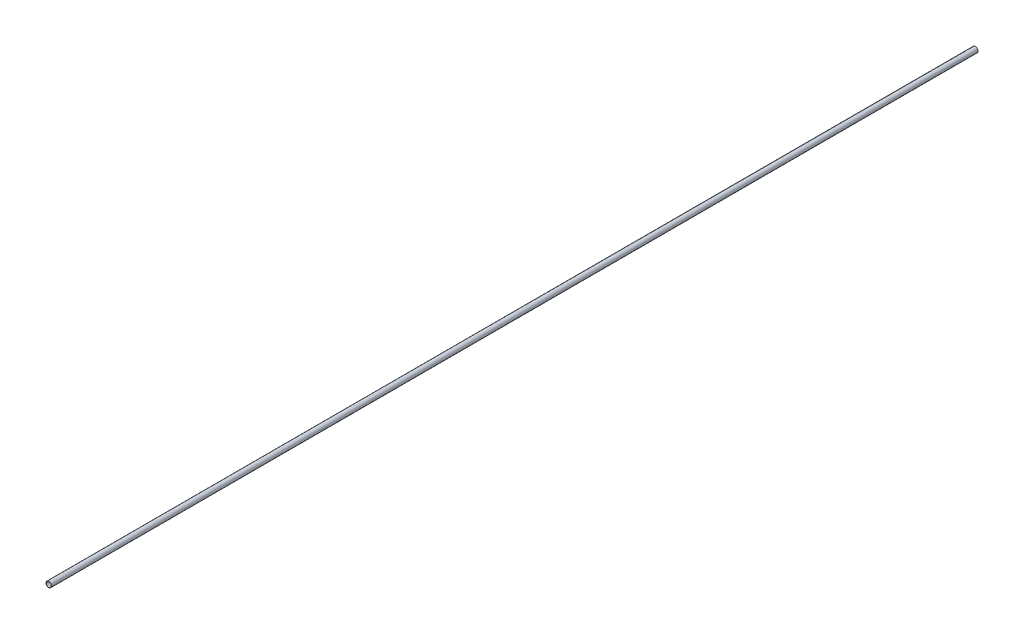
ISO-10303-21;
HEADER;
FILE_DESCRIPTION(('STEP AP214'),'2;1');
FILE_NAME('part.step','',(''),(''),'','','');
FILE_SCHEMA(('AUTOMOTIVE_DESIGN { 1 0 10303 214 1 1 1 1 }'));
ENDSEC;
DATA;
#1=APPLICATION_CONTEXT('core data for automotive mechanical design processes');
#2=APPLICATION_PROTOCOL_DEFINITION('international standard','automotive_design',2000,#1);
#3=PRODUCT_CONTEXT('',#1,'mechanical');
#4=PRODUCT('Part','Part','',(#3));
#5=PRODUCT_RELATED_PRODUCT_CATEGORY('part','',(#4));
#6=PRODUCT_DEFINITION_FORMATION('','',#4);
#7=PRODUCT_DEFINITION_CONTEXT('part definition',#1,'design');
#8=PRODUCT_DEFINITION('design','',#6,#7);
#9=PRODUCT_DEFINITION_SHAPE('','',#8);
#10=(LENGTH_UNIT() NAMED_UNIT(*) SI_UNIT(.MILLI.,.METRE.));
#11=(NAMED_UNIT(*) PLANE_ANGLE_UNIT() SI_UNIT($,.RADIAN.));
#12=(NAMED_UNIT(*) SI_UNIT($,.STERADIAN.) SOLID_ANGLE_UNIT());
#13=UNCERTAINTY_MEASURE_WITH_UNIT(LENGTH_MEASURE(1.E-05),#10,'distance_accuracy_value','');
#14=(GEOMETRIC_REPRESENTATION_CONTEXT(3) GLOBAL_UNCERTAINTY_ASSIGNED_CONTEXT((#13)) GLOBAL_UNIT_ASSIGNED_CONTEXT((#10,
#11,#12)) REPRESENTATION_CONTEXT('',''));
#15=CARTESIAN_POINT('',(0.,0.,0.));
#16=DIRECTION('',(0.,0.,1.));
#17=DIRECTION('',(1.,0.,0.));
#18=AXIS2_PLACEMENT_3D('',#15,#16,#17);
#19=CARTESIAN_POINT('',(0.,0.,3048.));
#20=DIRECTION('',(0.,0.,1.));
#21=DIRECTION('',(1.,0.,0.));
#22=AXIS2_PLACEMENT_3D('',#19,#20,#21);
#23=PLANE('',#22);
#24=CARTESIAN_POINT('',(0.,0.,3048.));
#25=DIRECTION('',(0.,0.,1.));
#26=DIRECTION('',(1.,0.,0.));
#27=AXIS2_PLACEMENT_3D('',#24,#25,#26);
#28=CIRCLE('',#27,8.9662);
#29=CARTESIAN_POINT('',(8.9662,0.,3048.));
#30=VERTEX_POINT('',#29);
#31=EDGE_CURVE('E10',#30,#30,#28,.T.);
#32=ORIENTED_EDGE('',*,*,#31,.T.);
#33=EDGE_LOOP('',(#32));
#34=FACE_BOUND('',#33,.T.);
#35=CARTESIAN_POINT('',(0.,0.,3048.));
#36=DIRECTION('',(0.,0.,1.));
#37=DIRECTION('',(1.,0.,0.));
#38=AXIS2_PLACEMENT_3D('',#35,#36,#37);
#39=CIRCLE('',#38,7.8994);
#40=CARTESIAN_POINT('',(7.8994,0.,3048.));
#41=VERTEX_POINT('',#40);
#42=EDGE_CURVE('E41',#41,#41,#39,.T.);
#43=ORIENTED_EDGE('',*,*,#42,.F.);
#44=EDGE_LOOP('',(#43));
#45=FACE_BOUND('',#44,.T.);
#46=ADVANCED_FACE('F30',(#34,#45),#23,.T.);
#47=CARTESIAN_POINT('',(0.,0.,0.));
#48=DIRECTION('',(0.,0.,1.));
#49=DIRECTION('',(1.,0.,0.));
#50=AXIS2_PLACEMENT_3D('',#47,#48,#49);
#51=PLANE('',#50);
#52=CARTESIAN_POINT('',(0.,0.,0.));
#53=DIRECTION('',(0.,0.,1.));
#54=DIRECTION('',(1.,0.,0.));
#55=AXIS2_PLACEMENT_3D('',#52,#53,#54);
#56=CIRCLE('',#55,8.9662);
#57=CARTESIAN_POINT('',(8.9662,0.,0.));
#58=VERTEX_POINT('',#57);
#59=EDGE_CURVE('E34',#58,#58,#56,.T.);
#60=ORIENTED_EDGE('',*,*,#59,.F.);
#61=EDGE_LOOP('',(#60));
#62=FACE_BOUND('',#61,.T.);
#63=CARTESIAN_POINT('',(0.,0.,0.));
#64=DIRECTION('',(0.,0.,1.));
#65=DIRECTION('',(1.,0.,0.));
#66=AXIS2_PLACEMENT_3D('',#63,#64,#65);
#67=CIRCLE('',#66,7.8994);
#68=CARTESIAN_POINT('',(7.8994,0.,0.));
#69=VERTEX_POINT('',#68);
#70=EDGE_CURVE('E43',#69,#69,#67,.T.);
#71=ORIENTED_EDGE('',*,*,#70,.T.);
#72=EDGE_LOOP('',(#71));
#73=FACE_BOUND('',#72,.T.);
#74=ADVANCED_FACE('F53',(#62,#73),#51,.F.);
#75=CARTESIAN_POINT('',(0.,0.,3048.));
#76=DIRECTION('',(0.,0.,-1.));
#77=DIRECTION('',(-1.,0.,0.));
#78=AXIS2_PLACEMENT_3D('',#75,#76,#77);
#79=CYLINDRICAL_SURFACE('',#78,8.9662);
#80=ORIENTED_EDGE('',*,*,#31,.F.);
#81=EDGE_LOOP('',(#80));
#82=FACE_BOUND('',#81,.T.);
#83=ORIENTED_EDGE('',*,*,#59,.T.);
#84=EDGE_LOOP('',(#83));
#85=FACE_BOUND('',#84,.T.);
#86=ADVANCED_FACE('F32',(#82,#85),#79,.T.);
#87=CARTESIAN_POINT('',(0.,0.,3048.));
#88=DIRECTION('',(0.,0.,-1.));
#89=DIRECTION('',(-1.,0.,0.));
#90=AXIS2_PLACEMENT_3D('',#87,#88,#89);
#91=CYLINDRICAL_SURFACE('',#90,7.8994);
#92=ORIENTED_EDGE('',*,*,#42,.T.);
#93=EDGE_LOOP('',(#92));
#94=FACE_BOUND('',#93,.T.);
#95=ORIENTED_EDGE('',*,*,#70,.F.);
#96=EDGE_LOOP('',(#95));
#97=FACE_BOUND('',#96,.T.);
#98=ADVANCED_FACE('F49',(#94,#97),#91,.F.);
#99=CLOSED_SHELL('',(#46,#74,#86,#98));
#100=MANIFOLD_SOLID_BREP('B2',#99);
#101=ADVANCED_BREP_SHAPE_REPRESENTATION('',(#18,#100),#14);
#102=SHAPE_DEFINITION_REPRESENTATION(#9,#101);
ENDSEC;
END-ISO-10303-21;
